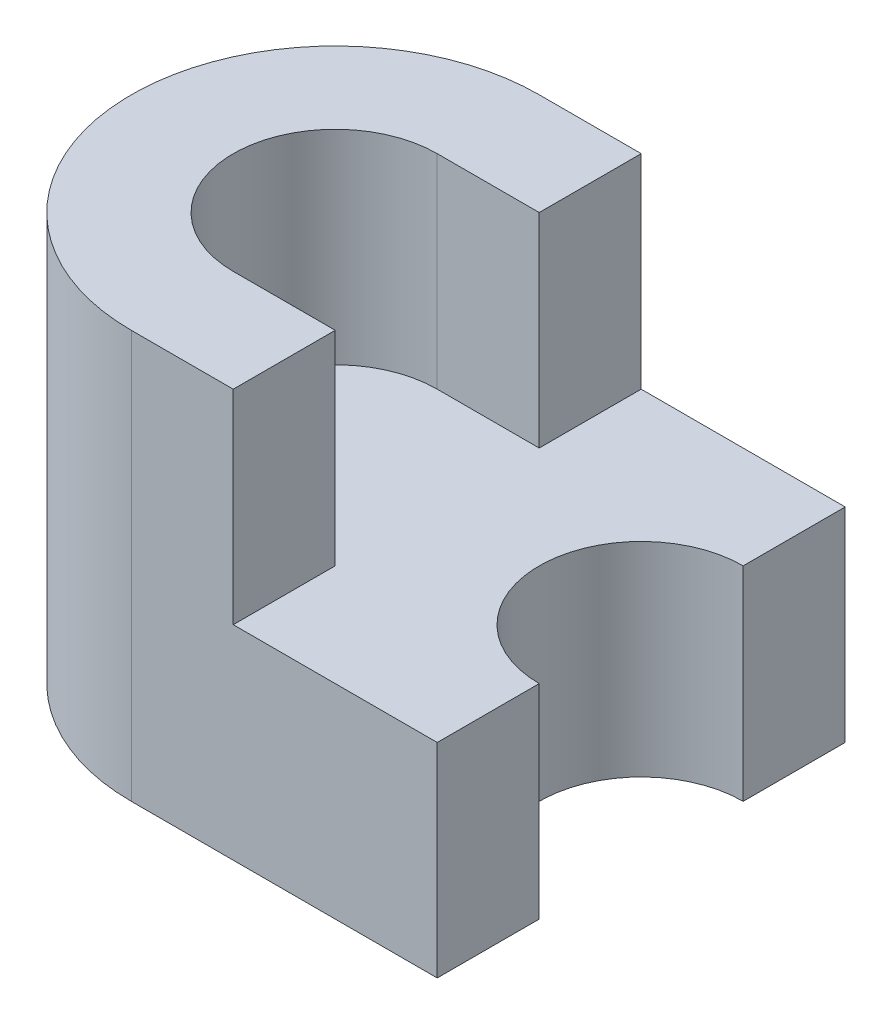
ISO-10303-21;
HEADER;
FILE_DESCRIPTION(('STEP AP214'),'2;1');
FILE_NAME('part.step','',(''),(''),'','','');
FILE_SCHEMA(('AUTOMOTIVE_DESIGN { 1 0 10303 214 1 1 1 1 }'));
ENDSEC;
DATA;
#1=APPLICATION_CONTEXT('core data for automotive mechanical design processes');
#2=APPLICATION_PROTOCOL_DEFINITION('international standard','automotive_design',2000,#1);
#3=PRODUCT_CONTEXT('',#1,'mechanical');
#4=PRODUCT('Part','Part','',(#3));
#5=PRODUCT_RELATED_PRODUCT_CATEGORY('part','',(#4));
#6=PRODUCT_DEFINITION_FORMATION('','',#4);
#7=PRODUCT_DEFINITION_CONTEXT('part definition',#1,'design');
#8=PRODUCT_DEFINITION('design','',#6,#7);
#9=PRODUCT_DEFINITION_SHAPE('','',#8);
#10=(LENGTH_UNIT() NAMED_UNIT(*) SI_UNIT(.MILLI.,.METRE.));
#11=(NAMED_UNIT(*) PLANE_ANGLE_UNIT() SI_UNIT($,.RADIAN.));
#12=(NAMED_UNIT(*) SI_UNIT($,.STERADIAN.) SOLID_ANGLE_UNIT());
#13=UNCERTAINTY_MEASURE_WITH_UNIT(LENGTH_MEASURE(1.E-05),#10,'distance_accuracy_value','');
#14=(GEOMETRIC_REPRESENTATION_CONTEXT(3) GLOBAL_UNCERTAINTY_ASSIGNED_CONTEXT((#13)) GLOBAL_UNIT_ASSIGNED_CONTEXT((#10,
#11,#12)) REPRESENTATION_CONTEXT('',''));
#15=CARTESIAN_POINT('',(0.,0.,0.));
#16=DIRECTION('',(0.,0.,1.));
#17=DIRECTION('',(1.,0.,0.));
#18=AXIS2_PLACEMENT_3D('',#15,#16,#17);
#19=CARTESIAN_POINT('',(-15.,10.,0.));
#20=DIRECTION('',(0.,1.,0.));
#21=DIRECTION('',(0.,0.,1.));
#22=AXIS2_PLACEMENT_3D('',#19,#20,#21);
#23=PLANE('',#22);
#24=DIRECTION('',(1.,0.,0.));
#25=VECTOR('',#24,1.);
#26=CARTESIAN_POINT('',(0.,10.,5.));
#27=LINE('',#26,#25);
#28=CARTESIAN_POINT('',(-15.,10.,5.));
#29=VERTEX_POINT('',#28);
#30=CARTESIAN_POINT('',(-10.,10.,5.));
#31=VERTEX_POINT('',#30);
#32=EDGE_CURVE('E151',#29,#31,#27,.T.);
#33=ORIENTED_EDGE('',*,*,#32,.T.);
#34=DIRECTION('',(0.,0.,1.));
#35=VECTOR('',#34,1.);
#36=CARTESIAN_POINT('',(-10.,10.,0.));
#37=LINE('',#36,#35);
#38=CARTESIAN_POINT('',(-10.,10.,10.));
#39=VERTEX_POINT('',#38);
#40=EDGE_CURVE('E177',#31,#39,#37,.T.);
#41=ORIENTED_EDGE('',*,*,#40,.T.);
#42=DIRECTION('',(1.,0.,0.));
#43=VECTOR('',#42,1.);
#44=CARTESIAN_POINT('',(0.,10.,10.));
#45=LINE('',#44,#43);
#46=CARTESIAN_POINT('',(0.,10.,10.));
#47=VERTEX_POINT('',#46);
#48=EDGE_CURVE('E91',#39,#47,#45,.T.);
#49=ORIENTED_EDGE('',*,*,#48,.T.);
#50=DIRECTION('',(0.,0.,-1.));
#51=VECTOR('',#50,1.);
#52=CARTESIAN_POINT('',(0.,10.,5.));
#53=LINE('',#52,#51);
#54=CARTESIAN_POINT('',(0.,10.,5.));
#55=VERTEX_POINT('',#54);
#56=EDGE_CURVE('E192',#47,#55,#53,.T.);
#57=ORIENTED_EDGE('',*,*,#56,.T.);
#58=CARTESIAN_POINT('',(0.,10.,0.));
#59=DIRECTION('',(0.,-1.,0.));
#60=DIRECTION('',(0.,0.,1.));
#61=AXIS2_PLACEMENT_3D('',#58,#59,#60);
#62=CIRCLE('',#61,5.);
#63=CARTESIAN_POINT('',(0.,10.,-5.));
#64=VERTEX_POINT('',#63);
#65=EDGE_CURVE('E194',#55,#64,#62,.T.);
#66=ORIENTED_EDGE('',*,*,#65,.T.);
#67=DIRECTION('',(0.,0.,-1.));
#68=VECTOR('',#67,1.);
#69=CARTESIAN_POINT('',(0.,10.,-5.));
#70=LINE('',#69,#68);
#71=CARTESIAN_POINT('',(0.,10.,-10.));
#72=VERTEX_POINT('',#71);
#73=EDGE_CURVE('E57',#64,#72,#70,.T.);
#74=ORIENTED_EDGE('',*,*,#73,.T.);
#75=DIRECTION('',(-1.,0.,0.));
#76=VECTOR('',#75,1.);
#77=CARTESIAN_POINT('',(0.,10.,-10.));
#78=LINE('',#77,#76);
#79=CARTESIAN_POINT('',(-10.,10.,-10.));
#80=VERTEX_POINT('',#79);
#81=EDGE_CURVE('E189',#72,#80,#78,.T.);
#82=ORIENTED_EDGE('',*,*,#81,.T.);
#83=DIRECTION('',(0.,0.,1.));
#84=VECTOR('',#83,1.);
#85=CARTESIAN_POINT('',(-10.,10.,0.));
#86=LINE('',#85,#84);
#87=CARTESIAN_POINT('',(-10.,10.,-5.));
#88=VERTEX_POINT('',#87);
#89=EDGE_CURVE('E174',#80,#88,#86,.T.);
#90=ORIENTED_EDGE('',*,*,#89,.T.);
#91=DIRECTION('',(-1.,0.,0.));
#92=VECTOR('',#91,1.);
#93=CARTESIAN_POINT('',(0.,10.,-5.));
#94=LINE('',#93,#92);
#95=CARTESIAN_POINT('',(-15.,10.,-5.));
#96=VERTEX_POINT('',#95);
#97=EDGE_CURVE('E172',#88,#96,#94,.T.);
#98=ORIENTED_EDGE('',*,*,#97,.T.);
#99=CARTESIAN_POINT('',(-15.,10.,0.));
#100=DIRECTION('',(0.,1.,0.));
#101=DIRECTION('',(0.,0.,1.));
#102=AXIS2_PLACEMENT_3D('',#99,#100,#101);
#103=CIRCLE('',#102,5.);
#104=EDGE_CURVE('E48',#96,#29,#103,.T.);
#105=ORIENTED_EDGE('',*,*,#104,.T.);
#106=EDGE_LOOP('',(#33,#41,#49,#57,#66,#74,#82,#90,#98,#105));
#107=FACE_BOUND('',#106,.T.);
#108=ADVANCED_FACE('F33',(#107),#23,.T.);
#109=CARTESIAN_POINT('',(0.,10.,-10.));
#110=DIRECTION('',(0.,0.,1.));
#111=DIRECTION('',(1.,0.,0.));
#112=AXIS2_PLACEMENT_3D('',#109,#110,#111);
#113=PLANE('',#112);
#114=DIRECTION('',(-1.,0.,0.));
#115=VECTOR('',#114,1.);
#116=CARTESIAN_POINT('',(0.,0.,-10.));
#117=LINE('',#116,#115);
#118=CARTESIAN_POINT('',(0.,0.,-10.));
#119=VERTEX_POINT('',#118);
#120=CARTESIAN_POINT('',(-15.,0.,-10.));
#121=VERTEX_POINT('',#120);
#122=EDGE_CURVE('E139',#119,#121,#117,.T.);
#123=ORIENTED_EDGE('',*,*,#122,.T.);
#124=DIRECTION('',(0.,-1.,0.));
#125=VECTOR('',#124,1.);
#126=CARTESIAN_POINT('',(-15.,10.,-10.));
#127=LINE('',#126,#125);
#128=CARTESIAN_POINT('',(-15.,20.,-10.));
#129=VERTEX_POINT('',#128);
#130=EDGE_CURVE('E11',#129,#121,#127,.T.);
#131=ORIENTED_EDGE('',*,*,#130,.F.);
#132=DIRECTION('',(-1.,0.,0.));
#133=VECTOR('',#132,1.);
#134=CARTESIAN_POINT('',(0.,20.,-10.));
#135=LINE('',#134,#133);
#136=CARTESIAN_POINT('',(-10.,20.,-10.));
#137=VERTEX_POINT('',#136);
#138=EDGE_CURVE('E156',#137,#129,#135,.T.);
#139=ORIENTED_EDGE('',*,*,#138,.F.);
#140=DIRECTION('',(0.,-1.,0.));
#141=VECTOR('',#140,1.);
#142=CARTESIAN_POINT('',(-10.,20.,-10.));
#143=LINE('',#142,#141);
#144=EDGE_CURVE('E186',#137,#80,#143,.T.);
#145=ORIENTED_EDGE('',*,*,#144,.T.);
#146=ORIENTED_EDGE('',*,*,#81,.F.);
#147=DIRECTION('',(0.,-1.,0.));
#148=VECTOR('',#147,1.);
#149=CARTESIAN_POINT('',(0.,10.,-10.));
#150=LINE('',#149,#148);
#151=EDGE_CURVE('E197',#72,#119,#150,.T.);
#152=ORIENTED_EDGE('',*,*,#151,.T.);
#153=EDGE_LOOP('',(#123,#131,#139,#145,#146,#152));
#154=FACE_BOUND('',#153,.T.);
#155=ADVANCED_FACE('F35',(#154),#113,.F.);
#156=CARTESIAN_POINT('',(-15.,10.,0.));
#157=DIRECTION('',(0.,-1.,0.));
#158=DIRECTION('',(0.,0.,-1.));
#159=AXIS2_PLACEMENT_3D('',#156,#157,#158);
#160=CYLINDRICAL_SURFACE('',#159,10.);
#161=CARTESIAN_POINT('',(-15.,0.,0.));
#162=DIRECTION('',(0.,1.,0.));
#163=DIRECTION('',(0.,0.,1.));
#164=AXIS2_PLACEMENT_3D('',#161,#162,#163);
#165=CIRCLE('',#164,10.);
#166=CARTESIAN_POINT('',(-15.,0.,10.));
#167=VERTEX_POINT('',#166);
#168=EDGE_CURVE('E200',#121,#167,#165,.T.);
#169=ORIENTED_EDGE('',*,*,#168,.T.);
#170=DIRECTION('',(0.,-1.,0.));
#171=VECTOR('',#170,1.);
#172=CARTESIAN_POINT('',(-15.,10.,10.));
#173=LINE('',#172,#171);
#174=CARTESIAN_POINT('',(-15.,20.,10.));
#175=VERTEX_POINT('',#174);
#176=EDGE_CURVE('E41',#175,#167,#173,.T.);
#177=ORIENTED_EDGE('',*,*,#176,.F.);
#178=CARTESIAN_POINT('',(-15.,20.,0.));
#179=DIRECTION('',(0.,1.,0.));
#180=DIRECTION('',(0.,0.,1.));
#181=AXIS2_PLACEMENT_3D('',#178,#179,#180);
#182=CIRCLE('',#181,10.);
#183=EDGE_CURVE('E161',#129,#175,#182,.T.);
#184=ORIENTED_EDGE('',*,*,#183,.F.);
#185=ORIENTED_EDGE('',*,*,#130,.T.);
#186=EDGE_LOOP('',(#169,#177,#184,#185));
#187=FACE_BOUND('',#186,.T.);
#188=ADVANCED_FACE('F244',(#187),#160,.T.);
#189=CARTESIAN_POINT('',(0.,10.,10.));
#190=DIRECTION('',(0.,0.,-1.));
#191=DIRECTION('',(-1.,0.,0.));
#192=AXIS2_PLACEMENT_3D('',#189,#190,#191);
#193=PLANE('',#192);
#194=DIRECTION('',(1.,0.,0.));
#195=VECTOR('',#194,1.);
#196=CARTESIAN_POINT('',(0.,0.,10.));
#197=LINE('',#196,#195);
#198=CARTESIAN_POINT('',(0.,0.,10.));
#199=VERTEX_POINT('',#198);
#200=EDGE_CURVE('E202',#167,#199,#197,.T.);
#201=ORIENTED_EDGE('',*,*,#200,.T.);
#202=DIRECTION('',(0.,-1.,0.));
#203=VECTOR('',#202,1.);
#204=CARTESIAN_POINT('',(0.,10.,10.));
#205=LINE('',#204,#203);
#206=EDGE_CURVE('E215',#47,#199,#205,.T.);
#207=ORIENTED_EDGE('',*,*,#206,.F.);
#208=ORIENTED_EDGE('',*,*,#48,.F.);
#209=DIRECTION('',(0.,-1.,0.));
#210=VECTOR('',#209,1.);
#211=CARTESIAN_POINT('',(-10.,20.,10.));
#212=LINE('',#211,#210);
#213=CARTESIAN_POINT('',(-10.,20.,10.));
#214=VERTEX_POINT('',#213);
#215=EDGE_CURVE('E184',#214,#39,#212,.T.);
#216=ORIENTED_EDGE('',*,*,#215,.F.);
#217=DIRECTION('',(1.,0.,0.));
#218=VECTOR('',#217,1.);
#219=CARTESIAN_POINT('',(0.,20.,10.));
#220=LINE('',#219,#218);
#221=EDGE_CURVE('E164',#175,#214,#220,.T.);
#222=ORIENTED_EDGE('',*,*,#221,.F.);
#223=ORIENTED_EDGE('',*,*,#176,.T.);
#224=EDGE_LOOP('',(#201,#207,#208,#216,#222,#223));
#225=FACE_BOUND('',#224,.T.);
#226=ADVANCED_FACE('F221',(#225),#193,.F.);
#227=CARTESIAN_POINT('',(0.,10.,5.));
#228=DIRECTION('',(-1.,0.,0.));
#229=DIRECTION('',(0.,0.,1.));
#230=AXIS2_PLACEMENT_3D('',#227,#228,#229);
#231=PLANE('',#230);
#232=DIRECTION('',(0.,0.,-1.));
#233=VECTOR('',#232,1.);
#234=CARTESIAN_POINT('',(0.,0.,5.));
#235=LINE('',#234,#233);
#236=CARTESIAN_POINT('',(0.,0.,5.));
#237=VERTEX_POINT('',#236);
#238=EDGE_CURVE('E204',#199,#237,#235,.T.);
#239=ORIENTED_EDGE('',*,*,#238,.T.);
#240=DIRECTION('',(0.,-1.,0.));
#241=VECTOR('',#240,1.);
#242=CARTESIAN_POINT('',(0.,10.,5.));
#243=LINE('',#242,#241);
#244=EDGE_CURVE('E212',#55,#237,#243,.T.);
#245=ORIENTED_EDGE('',*,*,#244,.F.);
#246=ORIENTED_EDGE('',*,*,#56,.F.);
#247=ORIENTED_EDGE('',*,*,#206,.T.);
#248=EDGE_LOOP('',(#239,#245,#246,#247));
#249=FACE_BOUND('',#248,.T.);
#250=ADVANCED_FACE('F232',(#249),#231,.F.);
#251=CARTESIAN_POINT('',(0.,10.,0.));
#252=DIRECTION('',(0.,-1.,0.));
#253=DIRECTION('',(0.,0.,-1.));
#254=AXIS2_PLACEMENT_3D('',#251,#252,#253);
#255=CYLINDRICAL_SURFACE('',#254,5.);
#256=CARTESIAN_POINT('',(0.,0.,0.));
#257=DIRECTION('',(0.,-1.,0.));
#258=DIRECTION('',(0.,0.,1.));
#259=AXIS2_PLACEMENT_3D('',#256,#257,#258);
#260=CIRCLE('',#259,5.);
#261=CARTESIAN_POINT('',(0.,0.,-5.));
#262=VERTEX_POINT('',#261);
#263=EDGE_CURVE('E206',#237,#262,#260,.T.);
#264=ORIENTED_EDGE('',*,*,#263,.T.);
#265=DIRECTION('',(0.,-1.,0.));
#266=VECTOR('',#265,1.);
#267=CARTESIAN_POINT('',(0.,10.,-5.));
#268=LINE('',#267,#266);
#269=EDGE_CURVE('E210',#64,#262,#268,.T.);
#270=ORIENTED_EDGE('',*,*,#269,.F.);
#271=ORIENTED_EDGE('',*,*,#65,.F.);
#272=ORIENTED_EDGE('',*,*,#244,.T.);
#273=EDGE_LOOP('',(#264,#270,#271,#272));
#274=FACE_BOUND('',#273,.T.);
#275=ADVANCED_FACE('F236',(#274),#255,.F.);
#276=CARTESIAN_POINT('',(0.,10.,-5.));
#277=DIRECTION('',(-1.,0.,0.));
#278=DIRECTION('',(0.,0.,1.));
#279=AXIS2_PLACEMENT_3D('',#276,#277,#278);
#280=PLANE('',#279);
#281=DIRECTION('',(0.,0.,-1.));
#282=VECTOR('',#281,1.);
#283=CARTESIAN_POINT('',(0.,0.,-5.));
#284=LINE('',#283,#282);
#285=EDGE_CURVE('E84',#262,#119,#284,.T.);
#286=ORIENTED_EDGE('',*,*,#285,.T.);
#287=ORIENTED_EDGE('',*,*,#151,.F.);
#288=ORIENTED_EDGE('',*,*,#73,.F.);
#289=ORIENTED_EDGE('',*,*,#269,.T.);
#290=EDGE_LOOP('',(#286,#287,#288,#289));
#291=FACE_BOUND('',#290,.T.);
#292=ADVANCED_FACE('F251',(#291),#280,.F.);
#293=CARTESIAN_POINT('',(-15.,0.,0.));
#294=DIRECTION('',(0.,1.,0.));
#295=DIRECTION('',(0.,0.,1.));
#296=AXIS2_PLACEMENT_3D('',#293,#294,#295);
#297=PLANE('',#296);
#298=ORIENTED_EDGE('',*,*,#122,.F.);
#299=ORIENTED_EDGE('',*,*,#285,.F.);
#300=ORIENTED_EDGE('',*,*,#263,.F.);
#301=ORIENTED_EDGE('',*,*,#238,.F.);
#302=ORIENTED_EDGE('',*,*,#200,.F.);
#303=ORIENTED_EDGE('',*,*,#168,.F.);
#304=EDGE_LOOP('',(#298,#299,#300,#301,#302,#303));
#305=FACE_BOUND('',#304,.T.);
#306=ADVANCED_FACE('F228',(#305),#297,.F.);
#307=CARTESIAN_POINT('',(-15.,20.,0.));
#308=DIRECTION('',(0.,-1.,0.));
#309=DIRECTION('',(0.,0.,-1.));
#310=AXIS2_PLACEMENT_3D('',#307,#308,#309);
#311=CYLINDRICAL_SURFACE('',#310,5.);
#312=ORIENTED_EDGE('',*,*,#104,.F.);
#313=DIRECTION('',(0.,-1.,0.));
#314=VECTOR('',#313,1.);
#315=CARTESIAN_POINT('',(-15.,20.,-5.));
#316=LINE('',#315,#314);
#317=CARTESIAN_POINT('',(-15.,20.,-5.));
#318=VERTEX_POINT('',#317);
#319=EDGE_CURVE('E130',#318,#96,#316,.T.);
#320=ORIENTED_EDGE('',*,*,#319,.F.);
#321=CARTESIAN_POINT('',(-15.,20.,0.));
#322=DIRECTION('',(0.,1.,0.));
#323=DIRECTION('',(0.,0.,1.));
#324=AXIS2_PLACEMENT_3D('',#321,#322,#323);
#325=CIRCLE('',#324,5.);
#326=CARTESIAN_POINT('',(-15.,20.,5.));
#327=VERTEX_POINT('',#326);
#328=EDGE_CURVE('E133',#318,#327,#325,.T.);
#329=ORIENTED_EDGE('',*,*,#328,.T.);
#330=DIRECTION('',(0.,-1.,0.));
#331=VECTOR('',#330,1.);
#332=CARTESIAN_POINT('',(-15.,20.,5.));
#333=LINE('',#332,#331);
#334=EDGE_CURVE('E170',#327,#29,#333,.T.);
#335=ORIENTED_EDGE('',*,*,#334,.T.);
#336=EDGE_LOOP('',(#312,#320,#329,#335));
#337=FACE_BOUND('',#336,.T.);
#338=ADVANCED_FACE('F132',(#337),#311,.F.);
#339=CARTESIAN_POINT('',(0.,20.,-5.));
#340=DIRECTION('',(0.,0.,1.));
#341=DIRECTION('',(1.,0.,0.));
#342=AXIS2_PLACEMENT_3D('',#339,#340,#341);
#343=PLANE('',#342);
#344=ORIENTED_EDGE('',*,*,#97,.F.);
#345=DIRECTION('',(0.,-1.,0.));
#346=VECTOR('',#345,1.);
#347=CARTESIAN_POINT('',(-10.,20.,-5.));
#348=LINE('',#347,#346);
#349=CARTESIAN_POINT('',(-10.,20.,-5.));
#350=VERTEX_POINT('',#349);
#351=EDGE_CURVE('E140',#350,#88,#348,.T.);
#352=ORIENTED_EDGE('',*,*,#351,.F.);
#353=DIRECTION('',(-1.,0.,0.));
#354=VECTOR('',#353,1.);
#355=CARTESIAN_POINT('',(0.,20.,-5.));
#356=LINE('',#355,#354);
#357=EDGE_CURVE('E146',#350,#318,#356,.T.);
#358=ORIENTED_EDGE('',*,*,#357,.T.);
#359=ORIENTED_EDGE('',*,*,#319,.T.);
#360=EDGE_LOOP('',(#344,#352,#358,#359));
#361=FACE_BOUND('',#360,.T.);
#362=ADVANCED_FACE('F153',(#361),#343,.T.);
#363=CARTESIAN_POINT('',(-10.,20.,0.));
#364=DIRECTION('',(1.,0.,0.));
#365=DIRECTION('',(0.,0.,-1.));
#366=AXIS2_PLACEMENT_3D('',#363,#364,#365);
#367=PLANE('',#366);
#368=ORIENTED_EDGE('',*,*,#89,.F.);
#369=ORIENTED_EDGE('',*,*,#144,.F.);
#370=DIRECTION('',(0.,0.,1.));
#371=VECTOR('',#370,1.);
#372=CARTESIAN_POINT('',(-10.,20.,0.));
#373=LINE('',#372,#371);
#374=EDGE_CURVE('E154',#137,#350,#373,.T.);
#375=ORIENTED_EDGE('',*,*,#374,.T.);
#376=ORIENTED_EDGE('',*,*,#351,.T.);
#377=EDGE_LOOP('',(#368,#369,#375,#376));
#378=FACE_BOUND('',#377,.T.);
#379=ADVANCED_FACE('F266',(#378),#367,.T.);
#380=CARTESIAN_POINT('',(-10.,20.,0.));
#381=DIRECTION('',(1.,0.,0.));
#382=DIRECTION('',(0.,0.,-1.));
#383=AXIS2_PLACEMENT_3D('',#380,#381,#382);
#384=PLANE('',#383);
#385=ORIENTED_EDGE('',*,*,#40,.F.);
#386=DIRECTION('',(0.,-1.,0.));
#387=VECTOR('',#386,1.);
#388=CARTESIAN_POINT('',(-10.,20.,5.));
#389=LINE('',#388,#387);
#390=CARTESIAN_POINT('',(-10.,20.,5.));
#391=VERTEX_POINT('',#390);
#392=EDGE_CURVE('E182',#391,#31,#389,.T.);
#393=ORIENTED_EDGE('',*,*,#392,.F.);
#394=DIRECTION('',(0.,0.,1.));
#395=VECTOR('',#394,1.);
#396=CARTESIAN_POINT('',(-10.,20.,0.));
#397=LINE('',#396,#395);
#398=EDGE_CURVE('E166',#391,#214,#397,.T.);
#399=ORIENTED_EDGE('',*,*,#398,.T.);
#400=ORIENTED_EDGE('',*,*,#215,.T.);
#401=EDGE_LOOP('',(#385,#393,#399,#400));
#402=FACE_BOUND('',#401,.T.);
#403=ADVANCED_FACE('F269',(#402),#384,.T.);
#404=CARTESIAN_POINT('',(0.,20.,5.));
#405=DIRECTION('',(0.,0.,-1.));
#406=DIRECTION('',(-1.,0.,0.));
#407=AXIS2_PLACEMENT_3D('',#404,#405,#406);
#408=PLANE('',#407);
#409=ORIENTED_EDGE('',*,*,#32,.F.);
#410=ORIENTED_EDGE('',*,*,#334,.F.);
#411=DIRECTION('',(1.,0.,0.));
#412=VECTOR('',#411,1.);
#413=CARTESIAN_POINT('',(0.,20.,5.));
#414=LINE('',#413,#412);
#415=EDGE_CURVE('E150',#327,#391,#414,.T.);
#416=ORIENTED_EDGE('',*,*,#415,.T.);
#417=ORIENTED_EDGE('',*,*,#392,.T.);
#418=EDGE_LOOP('',(#409,#410,#416,#417));
#419=FACE_BOUND('',#418,.T.);
#420=ADVANCED_FACE('F271',(#419),#408,.T.);
#421=CARTESIAN_POINT('',(0.,20.,0.));
#422=DIRECTION('',(0.,1.,0.));
#423=DIRECTION('',(0.,0.,1.));
#424=AXIS2_PLACEMENT_3D('',#421,#422,#423);
#425=PLANE('',#424);
#426=ORIENTED_EDGE('',*,*,#328,.F.);
#427=ORIENTED_EDGE('',*,*,#357,.F.);
#428=ORIENTED_EDGE('',*,*,#374,.F.);
#429=ORIENTED_EDGE('',*,*,#138,.T.);
#430=ORIENTED_EDGE('',*,*,#183,.T.);
#431=ORIENTED_EDGE('',*,*,#221,.T.);
#432=ORIENTED_EDGE('',*,*,#398,.F.);
#433=ORIENTED_EDGE('',*,*,#415,.F.);
#434=EDGE_LOOP('',(#426,#427,#428,#429,#430,#431,#432,#433));
#435=FACE_BOUND('',#434,.T.);
#436=ADVANCED_FACE('F144',(#435),#425,.T.);
#437=CLOSED_SHELL('',(#108,#155,#188,#226,#250,#275,#292,#306,#338,#362,#379,#403,#420,#436));
#438=MANIFOLD_SOLID_BREP('B2',#437);
#439=ADVANCED_BREP_SHAPE_REPRESENTATION('',(#18,#438),#14);
#440=SHAPE_DEFINITION_REPRESENTATION(#9,#439);
ENDSEC;
END-ISO-10303-21;
